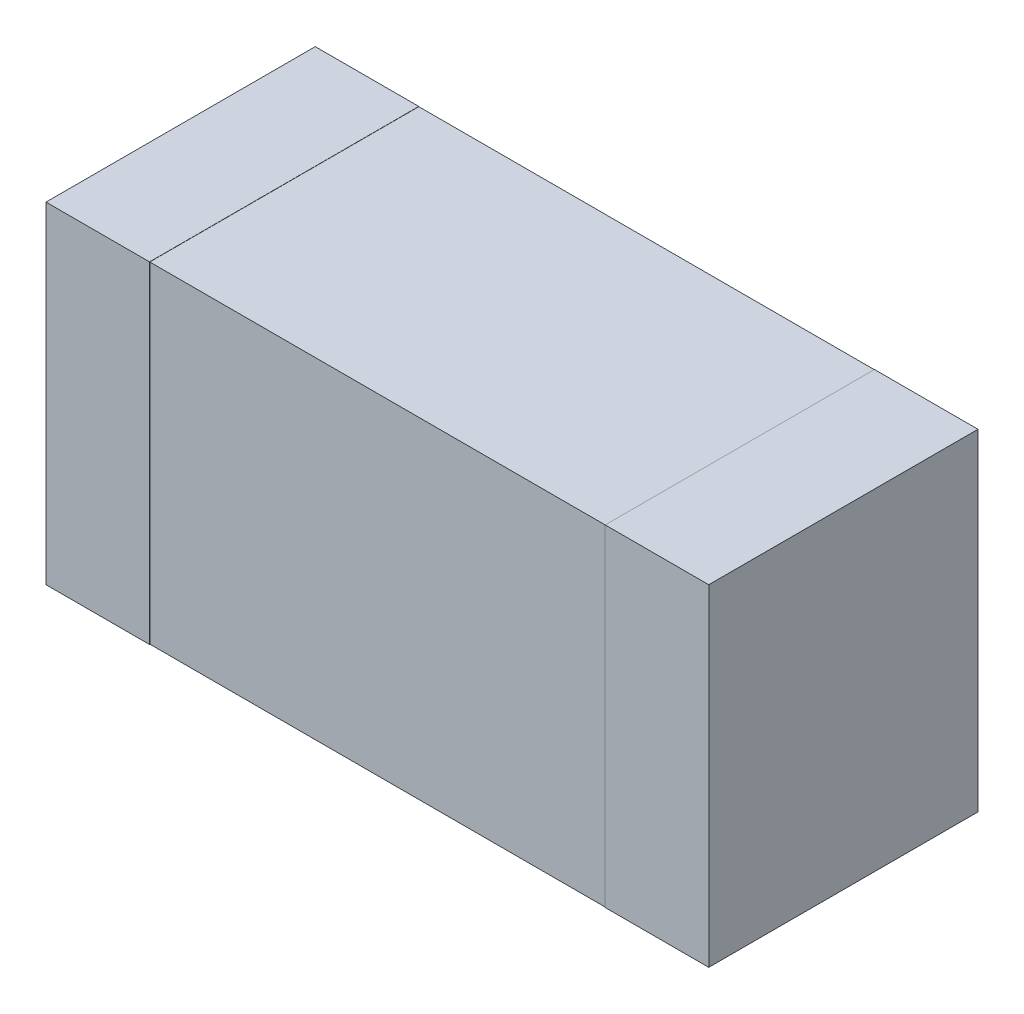
ISO-10303-21;
HEADER;
FILE_DESCRIPTION(('STEP AP214'),'2;1');
FILE_NAME('part.step','',(''),(''),'','','');
FILE_SCHEMA(('AUTOMOTIVE_DESIGN { 1 0 10303 214 1 1 1 1 }'));
ENDSEC;
DATA;
#1=APPLICATION_CONTEXT('core data for automotive mechanical design processes');
#2=APPLICATION_PROTOCOL_DEFINITION('international standard','automotive_design',2000,#1);
#3=PRODUCT_CONTEXT('',#1,'mechanical');
#4=PRODUCT('Part','Part','',(#3));
#5=PRODUCT_RELATED_PRODUCT_CATEGORY('part','',(#4));
#6=PRODUCT_DEFINITION_FORMATION('','',#4);
#7=PRODUCT_DEFINITION_CONTEXT('part definition',#1,'design');
#8=PRODUCT_DEFINITION('design','',#6,#7);
#9=PRODUCT_DEFINITION_SHAPE('','',#8);
#10=(LENGTH_UNIT() NAMED_UNIT(*) SI_UNIT(.MILLI.,.METRE.));
#11=(NAMED_UNIT(*) PLANE_ANGLE_UNIT() SI_UNIT($,.RADIAN.));
#12=(NAMED_UNIT(*) SI_UNIT($,.STERADIAN.) SOLID_ANGLE_UNIT());
#13=UNCERTAINTY_MEASURE_WITH_UNIT(LENGTH_MEASURE(1.E-05),#10,'distance_accuracy_value','');
#14=(GEOMETRIC_REPRESENTATION_CONTEXT(3) GLOBAL_UNCERTAINTY_ASSIGNED_CONTEXT((#13)) GLOBAL_UNIT_ASSIGNED_CONTEXT((#10,
#11,#12)) REPRESENTATION_CONTEXT('',''));
#15=CARTESIAN_POINT('',(0.,0.,0.));
#16=DIRECTION('',(0.,0.,1.));
#17=DIRECTION('',(1.,0.,0.));
#18=AXIS2_PLACEMENT_3D('',#15,#16,#17);
#19=CARTESIAN_POINT('',(-1.6,-0.8,1.3));
#20=DIRECTION('',(0.,1.,0.));
#21=DIRECTION('',(1.,0.,0.));
#22=AXIS2_PLACEMENT_3D('',#19,#20,#21);
#23=PLANE('',#22);
#24=DIRECTION('',(0.,0.,-1.));
#25=VECTOR('',#24,1.);
#26=CARTESIAN_POINT('',(1.1,-0.8,1.3));
#27=LINE('',#26,#25);
#28=CARTESIAN_POINT('',(1.1,-0.8,1.3));
#29=VERTEX_POINT('',#28);
#30=CARTESIAN_POINT('',(1.1,-0.8,0.));
#31=VERTEX_POINT('',#30);
#32=EDGE_CURVE('E235',#29,#31,#27,.T.);
#33=ORIENTED_EDGE('',*,*,#32,.T.);
#34=DIRECTION('',(-1.,0.,0.));
#35=VECTOR('',#34,1.);
#36=CARTESIAN_POINT('',(-1.6,-0.8,0.));
#37=LINE('',#36,#35);
#38=CARTESIAN_POINT('',(1.6,-0.8,0.));
#39=VERTEX_POINT('',#38);
#40=EDGE_CURVE('E184',#39,#31,#37,.T.);
#41=ORIENTED_EDGE('',*,*,#40,.F.);
#42=DIRECTION('',(0.,0.,1.));
#43=VECTOR('',#42,1.);
#44=CARTESIAN_POINT('',(1.6,-0.8,1.3));
#45=LINE('',#44,#43);
#46=CARTESIAN_POINT('',(1.6,-0.8,1.3));
#47=VERTEX_POINT('',#46);
#48=EDGE_CURVE('E228',#39,#47,#45,.T.);
#49=ORIENTED_EDGE('',*,*,#48,.T.);
#50=DIRECTION('',(1.,0.,0.));
#51=VECTOR('',#50,1.);
#52=CARTESIAN_POINT('',(0.,-0.8,1.3));
#53=LINE('',#52,#51);
#54=EDGE_CURVE('E10',#29,#47,#53,.T.);
#55=ORIENTED_EDGE('',*,*,#54,.F.);
#56=EDGE_LOOP('',(#33,#41,#49,#55));
#57=FACE_BOUND('',#56,.T.);
#58=ADVANCED_FACE('F17',(#57),#23,.F.);
#59=CARTESIAN_POINT('',(0.,0.,1.3));
#60=DIRECTION('',(0.,0.,1.));
#61=DIRECTION('',(1.,0.,0.));
#62=AXIS2_PLACEMENT_3D('',#59,#60,#61);
#63=PLANE('',#62);
#64=DIRECTION('',(0.,1.,0.));
#65=VECTOR('',#64,1.);
#66=CARTESIAN_POINT('',(1.6,0.8,1.3));
#67=LINE('',#66,#65);
#68=CARTESIAN_POINT('',(1.6,0.8,1.3));
#69=VERTEX_POINT('',#68);
#70=EDGE_CURVE('E222',#47,#69,#67,.T.);
#71=ORIENTED_EDGE('',*,*,#70,.T.);
#72=DIRECTION('',(-1.,0.,0.));
#73=VECTOR('',#72,1.);
#74=CARTESIAN_POINT('',(-1.6,0.8,1.3));
#75=LINE('',#74,#73);
#76=CARTESIAN_POINT('',(1.1,0.8,1.3));
#77=VERTEX_POINT('',#76);
#78=EDGE_CURVE('E26',#69,#77,#75,.T.);
#79=ORIENTED_EDGE('',*,*,#78,.T.);
#80=DIRECTION('',(0.,-1.,0.));
#81=VECTOR('',#80,1.);
#82=CARTESIAN_POINT('',(1.1,0.8,1.3));
#83=LINE('',#82,#81);
#84=EDGE_CURVE('E238',#77,#29,#83,.T.);
#85=ORIENTED_EDGE('',*,*,#84,.T.);
#86=ORIENTED_EDGE('',*,*,#54,.T.);
#87=EDGE_LOOP('',(#71,#79,#85,#86));
#88=FACE_BOUND('',#87,.T.);
#89=ADVANCED_FACE('F19',(#88),#63,.T.);
#90=CARTESIAN_POINT('',(-1.6,0.8,1.3));
#91=DIRECTION('',(0.,-1.,0.));
#92=DIRECTION('',(0.,0.,-1.));
#93=AXIS2_PLACEMENT_3D('',#90,#91,#92);
#94=PLANE('',#93);
#95=DIRECTION('',(0.,0.,1.));
#96=VECTOR('',#95,1.);
#97=CARTESIAN_POINT('',(1.1,0.8,1.3));
#98=LINE('',#97,#96);
#99=CARTESIAN_POINT('',(1.1,0.8,0.));
#100=VERTEX_POINT('',#99);
#101=EDGE_CURVE('E242',#100,#77,#98,.T.);
#102=ORIENTED_EDGE('',*,*,#101,.T.);
#103=ORIENTED_EDGE('',*,*,#78,.F.);
#104=DIRECTION('',(0.,0.,-1.));
#105=VECTOR('',#104,1.);
#106=CARTESIAN_POINT('',(1.6,0.8,1.3));
#107=LINE('',#106,#105);
#108=CARTESIAN_POINT('',(1.6,0.8,0.));
#109=VERTEX_POINT('',#108);
#110=EDGE_CURVE('E152',#69,#109,#107,.T.);
#111=ORIENTED_EDGE('',*,*,#110,.T.);
#112=DIRECTION('',(1.,0.,0.));
#113=VECTOR('',#112,1.);
#114=CARTESIAN_POINT('',(-1.6,0.8,0.));
#115=LINE('',#114,#113);
#116=EDGE_CURVE('E179',#100,#109,#115,.T.);
#117=ORIENTED_EDGE('',*,*,#116,.F.);
#118=EDGE_LOOP('',(#102,#103,#111,#117));
#119=FACE_BOUND('',#118,.T.);
#120=ADVANCED_FACE('F504',(#119),#94,.F.);
#121=CARTESIAN_POINT('',(-1.6,0.8,1.3));
#122=DIRECTION('',(0.,-1.,0.));
#123=DIRECTION('',(0.,0.,-1.));
#124=AXIS2_PLACEMENT_3D('',#121,#122,#123);
#125=PLANE('',#124);
#126=DIRECTION('',(0.,0.,-1.));
#127=VECTOR('',#126,1.);
#128=CARTESIAN_POINT('',(-1.1,0.8,1.3));
#129=LINE('',#128,#127);
#130=CARTESIAN_POINT('',(-1.1,0.8,1.3));
#131=VERTEX_POINT('',#130);
#132=CARTESIAN_POINT('',(-1.1,0.8,0.));
#133=VERTEX_POINT('',#132);
#134=EDGE_CURVE('E248',#131,#133,#129,.T.);
#135=ORIENTED_EDGE('',*,*,#134,.T.);
#136=DIRECTION('',(1.,0.,0.));
#137=VECTOR('',#136,1.);
#138=CARTESIAN_POINT('',(-1.6,0.8,0.));
#139=LINE('',#138,#137);
#140=CARTESIAN_POINT('',(-1.6,0.8,0.));
#141=VERTEX_POINT('',#140);
#142=EDGE_CURVE('E169',#141,#133,#139,.T.);
#143=ORIENTED_EDGE('',*,*,#142,.F.);
#144=DIRECTION('',(0.,0.,1.));
#145=VECTOR('',#144,1.);
#146=CARTESIAN_POINT('',(-1.6,0.8,1.3));
#147=LINE('',#146,#145);
#148=CARTESIAN_POINT('',(-1.6,0.8,1.3));
#149=VERTEX_POINT('',#148);
#150=EDGE_CURVE('E212',#141,#149,#147,.T.);
#151=ORIENTED_EDGE('',*,*,#150,.T.);
#152=DIRECTION('',(-1.,0.,0.));
#153=VECTOR('',#152,1.);
#154=CARTESIAN_POINT('',(0.,0.8,1.3));
#155=LINE('',#154,#153);
#156=EDGE_CURVE('E50',#131,#149,#155,.T.);
#157=ORIENTED_EDGE('',*,*,#156,.F.);
#158=EDGE_LOOP('',(#135,#143,#151,#157));
#159=FACE_BOUND('',#158,.T.);
#160=ADVANCED_FACE('F450',(#159),#125,.F.);
#161=CARTESIAN_POINT('',(0.,0.,1.3));
#162=DIRECTION('',(0.,0.,1.));
#163=DIRECTION('',(1.,0.,0.));
#164=AXIS2_PLACEMENT_3D('',#161,#162,#163);
#165=PLANE('',#164);
#166=ORIENTED_EDGE('',*,*,#156,.T.);
#167=DIRECTION('',(0.,-1.,0.));
#168=VECTOR('',#167,1.);
#169=CARTESIAN_POINT('',(-1.6,0.8,1.3));
#170=LINE('',#169,#168);
#171=CARTESIAN_POINT('',(-1.6,-0.8,1.3));
#172=VERTEX_POINT('',#171);
#173=EDGE_CURVE('E209',#149,#172,#170,.T.);
#174=ORIENTED_EDGE('',*,*,#173,.T.);
#175=DIRECTION('',(1.,0.,0.));
#176=VECTOR('',#175,1.);
#177=CARTESIAN_POINT('',(-1.6,-0.8,1.3));
#178=LINE('',#177,#176);
#179=CARTESIAN_POINT('',(-1.1,-0.8,1.3));
#180=VERTEX_POINT('',#179);
#181=EDGE_CURVE('E39',#172,#180,#178,.T.);
#182=ORIENTED_EDGE('',*,*,#181,.T.);
#183=DIRECTION('',(0.,1.,0.));
#184=VECTOR('',#183,1.);
#185=CARTESIAN_POINT('',(-1.1,0.8,1.3));
#186=LINE('',#185,#184);
#187=EDGE_CURVE('E251',#180,#131,#186,.T.);
#188=ORIENTED_EDGE('',*,*,#187,.T.);
#189=EDGE_LOOP('',(#166,#174,#182,#188));
#190=FACE_BOUND('',#189,.T.);
#191=ADVANCED_FACE('F445',(#190),#165,.T.);
#192=CARTESIAN_POINT('',(-1.6,-0.8,1.3));
#193=DIRECTION('',(0.,1.,0.));
#194=DIRECTION('',(1.,0.,0.));
#195=AXIS2_PLACEMENT_3D('',#192,#193,#194);
#196=PLANE('',#195);
#197=DIRECTION('',(0.,0.,1.));
#198=VECTOR('',#197,1.);
#199=CARTESIAN_POINT('',(-1.1,-0.8,1.3));
#200=LINE('',#199,#198);
#201=CARTESIAN_POINT('',(-1.1,-0.8,0.));
#202=VERTEX_POINT('',#201);
#203=EDGE_CURVE('E254',#202,#180,#200,.T.);
#204=ORIENTED_EDGE('',*,*,#203,.T.);
#205=ORIENTED_EDGE('',*,*,#181,.F.);
#206=DIRECTION('',(0.,0.,-1.));
#207=VECTOR('',#206,1.);
#208=CARTESIAN_POINT('',(-1.6,-0.8,1.3));
#209=LINE('',#208,#207);
#210=CARTESIAN_POINT('',(-1.6,-0.8,0.));
#211=VERTEX_POINT('',#210);
#212=EDGE_CURVE('E206',#172,#211,#209,.T.);
#213=ORIENTED_EDGE('',*,*,#212,.T.);
#214=DIRECTION('',(-1.,0.,0.));
#215=VECTOR('',#214,1.);
#216=CARTESIAN_POINT('',(-1.6,-0.8,0.));
#217=LINE('',#216,#215);
#218=EDGE_CURVE('E837',#202,#211,#217,.T.);
#219=ORIENTED_EDGE('',*,*,#218,.F.);
#220=EDGE_LOOP('',(#204,#205,#213,#219));
#221=FACE_BOUND('',#220,.T.);
#222=ADVANCED_FACE('F449',(#221),#196,.F.);
#223=CARTESIAN_POINT('',(-1.1,0.8,1.3));
#224=DIRECTION('',(-1.,0.,0.));
#225=DIRECTION('',(0.,0.,1.));
#226=AXIS2_PLACEMENT_3D('',#223,#224,#225);
#227=PLANE('',#226);
#228=ORIENTED_EDGE('',*,*,#134,.F.);
#229=ORIENTED_EDGE('',*,*,#187,.F.);
#230=ORIENTED_EDGE('',*,*,#203,.F.);
#231=DIRECTION('',(0.,-1.,0.));
#232=VECTOR('',#231,1.);
#233=CARTESIAN_POINT('',(-1.1,0.,0.));
#234=LINE('',#233,#232);
#235=CARTESIAN_POINT('',(-1.1,-0.799,0.));
#236=VERTEX_POINT('',#235);
#237=EDGE_CURVE('E833',#236,#202,#234,.T.);
#238=ORIENTED_EDGE('',*,*,#237,.F.);
#239=DIRECTION('',(0.,0.,1.));
#240=VECTOR('',#239,1.);
#241=CARTESIAN_POINT('',(-1.1,-0.799,1.3));
#242=LINE('',#241,#240);
#243=CARTESIAN_POINT('',(-1.1,-0.799,1.299));
#244=VERTEX_POINT('',#243);
#245=EDGE_CURVE('E200',#236,#244,#242,.T.);
#246=ORIENTED_EDGE('',*,*,#245,.T.);
#247=DIRECTION('',(0.,1.,0.));
#248=VECTOR('',#247,1.);
#249=CARTESIAN_POINT('',(-1.1,-0.8,1.299));
#250=LINE('',#249,#248);
#251=CARTESIAN_POINT('',(-1.1,0.799,1.299));
#252=VERTEX_POINT('',#251);
#253=EDGE_CURVE('E147',#244,#252,#250,.T.);
#254=ORIENTED_EDGE('',*,*,#253,.T.);
#255=DIRECTION('',(0.,0.,-1.));
#256=VECTOR('',#255,1.);
#257=CARTESIAN_POINT('',(-1.1,0.799,1.3));
#258=LINE('',#257,#256);
#259=CARTESIAN_POINT('',(-1.1,0.799,0.));
#260=VERTEX_POINT('',#259);
#261=EDGE_CURVE('E139',#252,#260,#258,.T.);
#262=ORIENTED_EDGE('',*,*,#261,.T.);
#263=DIRECTION('',(0.,-1.,0.));
#264=VECTOR('',#263,1.);
#265=CARTESIAN_POINT('',(-1.1,0.,0.));
#266=LINE('',#265,#264);
#267=EDGE_CURVE('E144',#133,#260,#266,.T.);
#268=ORIENTED_EDGE('',*,*,#267,.F.);
#269=EDGE_LOOP('',(#228,#229,#230,#238,#246,#254,#262,#268));
#270=FACE_BOUND('',#269,.T.);
#271=ADVANCED_FACE('F142',(#270),#227,.F.);
#272=CARTESIAN_POINT('',(1.1,-0.8,1.299));
#273=DIRECTION('',(0.,0.,-1.));
#274=DIRECTION('',(-1.,0.,0.));
#275=AXIS2_PLACEMENT_3D('',#272,#273,#274);
#276=PLANE('',#275);
#277=DIRECTION('',(-1.,0.,0.));
#278=VECTOR('',#277,1.);
#279=CARTESIAN_POINT('',(1.1,0.799,1.299));
#280=LINE('',#279,#278);
#281=CARTESIAN_POINT('',(1.1,0.799,1.299));
#282=VERTEX_POINT('',#281);
#283=EDGE_CURVE('E215',#282,#252,#280,.T.);
#284=ORIENTED_EDGE('',*,*,#283,.T.);
#285=ORIENTED_EDGE('',*,*,#253,.F.);
#286=DIRECTION('',(1.,0.,0.));
#287=VECTOR('',#286,1.);
#288=CARTESIAN_POINT('',(1.1,-0.799,1.299));
#289=LINE('',#288,#287);
#290=CARTESIAN_POINT('',(1.1,-0.799,1.299));
#291=VERTEX_POINT('',#290);
#292=EDGE_CURVE('E193',#244,#291,#289,.T.);
#293=ORIENTED_EDGE('',*,*,#292,.T.);
#294=DIRECTION('',(0.,1.,0.));
#295=VECTOR('',#294,1.);
#296=CARTESIAN_POINT('',(1.1,0.8,1.299));
#297=LINE('',#296,#295);
#298=EDGE_CURVE('E232',#291,#282,#297,.T.);
#299=ORIENTED_EDGE('',*,*,#298,.T.);
#300=EDGE_LOOP('',(#284,#285,#293,#299));
#301=FACE_BOUND('',#300,.T.);
#302=ADVANCED_FACE('F519',(#301),#276,.F.);
#303=CARTESIAN_POINT('',(1.1,0.8,1.3));
#304=DIRECTION('',(1.,0.,0.));
#305=DIRECTION('',(0.,1.,0.));
#306=AXIS2_PLACEMENT_3D('',#303,#304,#305);
#307=PLANE('',#306);
#308=DIRECTION('',(0.,0.,1.));
#309=VECTOR('',#308,1.);
#310=CARTESIAN_POINT('',(1.1,0.799,1.3));
#311=LINE('',#310,#309);
#312=CARTESIAN_POINT('',(1.1,0.799,0.));
#313=VERTEX_POINT('',#312);
#314=EDGE_CURVE('E153',#313,#282,#311,.T.);
#315=ORIENTED_EDGE('',*,*,#314,.T.);
#316=ORIENTED_EDGE('',*,*,#298,.F.);
#317=DIRECTION('',(0.,0.,-1.));
#318=VECTOR('',#317,1.);
#319=CARTESIAN_POINT('',(1.1,-0.799,1.3));
#320=LINE('',#319,#318);
#321=CARTESIAN_POINT('',(1.1,-0.799,0.));
#322=VERTEX_POINT('',#321);
#323=EDGE_CURVE('E203',#291,#322,#320,.T.);
#324=ORIENTED_EDGE('',*,*,#323,.T.);
#325=DIRECTION('',(0.,1.,0.));
#326=VECTOR('',#325,1.);
#327=CARTESIAN_POINT('',(1.1,0.,0.));
#328=LINE('',#327,#326);
#329=EDGE_CURVE('E188',#31,#322,#328,.T.);
#330=ORIENTED_EDGE('',*,*,#329,.F.);
#331=ORIENTED_EDGE('',*,*,#32,.F.);
#332=ORIENTED_EDGE('',*,*,#84,.F.);
#333=ORIENTED_EDGE('',*,*,#101,.F.);
#334=DIRECTION('',(0.,1.,0.));
#335=VECTOR('',#334,1.);
#336=CARTESIAN_POINT('',(1.1,0.,0.));
#337=LINE('',#336,#335);
#338=EDGE_CURVE('E163',#313,#100,#337,.T.);
#339=ORIENTED_EDGE('',*,*,#338,.F.);
#340=EDGE_LOOP('',(#315,#316,#324,#330,#331,#332,#333,#339));
#341=FACE_BOUND('',#340,.T.);
#342=ADVANCED_FACE('F495',(#341),#307,.F.);
#343=CARTESIAN_POINT('',(1.6,0.8,1.3));
#344=DIRECTION('',(-1.,0.,0.));
#345=DIRECTION('',(0.,1.,0.));
#346=AXIS2_PLACEMENT_3D('',#343,#344,#345);
#347=PLANE('',#346);
#348=ORIENTED_EDGE('',*,*,#110,.F.);
#349=ORIENTED_EDGE('',*,*,#70,.F.);
#350=ORIENTED_EDGE('',*,*,#48,.F.);
#351=DIRECTION('',(0.,1.,0.));
#352=VECTOR('',#351,1.);
#353=CARTESIAN_POINT('',(1.6,0.,0.));
#354=LINE('',#353,#352);
#355=EDGE_CURVE('E183',#39,#109,#354,.T.);
#356=ORIENTED_EDGE('',*,*,#355,.T.);
#357=EDGE_LOOP('',(#348,#349,#350,#356));
#358=FACE_BOUND('',#357,.T.);
#359=ADVANCED_FACE('F484',(#358),#347,.F.);
#360=CARTESIAN_POINT('',(1.1,0.799,1.3));
#361=DIRECTION('',(0.,-1.,0.));
#362=DIRECTION('',(0.,0.,-1.));
#363=AXIS2_PLACEMENT_3D('',#360,#361,#362);
#364=PLANE('',#363);
#365=ORIENTED_EDGE('',*,*,#283,.F.);
#366=ORIENTED_EDGE('',*,*,#314,.F.);
#367=DIRECTION('',(-1.,0.,0.));
#368=VECTOR('',#367,1.);
#369=CARTESIAN_POINT('',(0.,0.799,0.));
#370=LINE('',#369,#368);
#371=EDGE_CURVE('E156',#313,#260,#370,.T.);
#372=ORIENTED_EDGE('',*,*,#371,.T.);
#373=ORIENTED_EDGE('',*,*,#261,.F.);
#374=EDGE_LOOP('',(#365,#366,#372,#373));
#375=FACE_BOUND('',#374,.T.);
#376=ADVANCED_FACE('F157',(#375),#364,.F.);
#377=CARTESIAN_POINT('',(-1.6,0.8,1.3));
#378=DIRECTION('',(1.,0.,0.));
#379=DIRECTION('',(0.,1.,0.));
#380=AXIS2_PLACEMENT_3D('',#377,#378,#379);
#381=PLANE('',#380);
#382=ORIENTED_EDGE('',*,*,#212,.F.);
#383=ORIENTED_EDGE('',*,*,#173,.F.);
#384=ORIENTED_EDGE('',*,*,#150,.F.);
#385=DIRECTION('',(0.,-1.,0.));
#386=VECTOR('',#385,1.);
#387=CARTESIAN_POINT('',(-1.6,0.,0.));
#388=LINE('',#387,#386);
#389=EDGE_CURVE('E176',#141,#211,#388,.T.);
#390=ORIENTED_EDGE('',*,*,#389,.T.);
#391=EDGE_LOOP('',(#382,#383,#384,#390));
#392=FACE_BOUND('',#391,.T.);
#393=ADVANCED_FACE('F461',(#392),#381,.F.);
#394=CARTESIAN_POINT('',(1.1,-0.799,1.3));
#395=DIRECTION('',(0.,1.,0.));
#396=DIRECTION('',(1.,0.,0.));
#397=AXIS2_PLACEMENT_3D('',#394,#395,#396);
#398=PLANE('',#397);
#399=ORIENTED_EDGE('',*,*,#292,.F.);
#400=ORIENTED_EDGE('',*,*,#245,.F.);
#401=DIRECTION('',(1.,0.,0.));
#402=VECTOR('',#401,1.);
#403=CARTESIAN_POINT('',(0.,-0.799,0.));
#404=LINE('',#403,#402);
#405=EDGE_CURVE('E189',#236,#322,#404,.T.);
#406=ORIENTED_EDGE('',*,*,#405,.T.);
#407=ORIENTED_EDGE('',*,*,#323,.F.);
#408=EDGE_LOOP('',(#399,#400,#406,#407));
#409=FACE_BOUND('',#408,.T.);
#410=ADVANCED_FACE('F436',(#409),#398,.F.);
#411=CARTESIAN_POINT('',(0.,0.,0.));
#412=DIRECTION('',(0.,0.,1.));
#413=DIRECTION('',(1.,0.,0.));
#414=AXIS2_PLACEMENT_3D('',#411,#412,#413);
#415=PLANE('',#414);
#416=ORIENTED_EDGE('',*,*,#237,.T.);
#417=ORIENTED_EDGE('',*,*,#218,.T.);
#418=ORIENTED_EDGE('',*,*,#389,.F.);
#419=ORIENTED_EDGE('',*,*,#142,.T.);
#420=ORIENTED_EDGE('',*,*,#267,.T.);
#421=ORIENTED_EDGE('',*,*,#371,.F.);
#422=ORIENTED_EDGE('',*,*,#338,.T.);
#423=ORIENTED_EDGE('',*,*,#116,.T.);
#424=ORIENTED_EDGE('',*,*,#355,.F.);
#425=ORIENTED_EDGE('',*,*,#40,.T.);
#426=ORIENTED_EDGE('',*,*,#329,.T.);
#427=ORIENTED_EDGE('',*,*,#405,.F.);
#428=EDGE_LOOP('',(#416,#417,#418,#419,#420,#421,#422,#423,#424,#425,#426,#427));
#429=FACE_BOUND('',#428,.T.);
#430=ADVANCED_FACE('F166',(#429),#415,.F.);
#431=CLOSED_SHELL('',(#58,#89,#120,#160,#191,#222,#271,#302,#342,#359,#376,#393,#410,#430));
#432=MANIFOLD_SOLID_BREP('B1',#431);
#433=ADVANCED_BREP_SHAPE_REPRESENTATION('',(#18,#432),#14);
#434=SHAPE_DEFINITION_REPRESENTATION(#9,#433);
ENDSEC;
END-ISO-10303-21;
